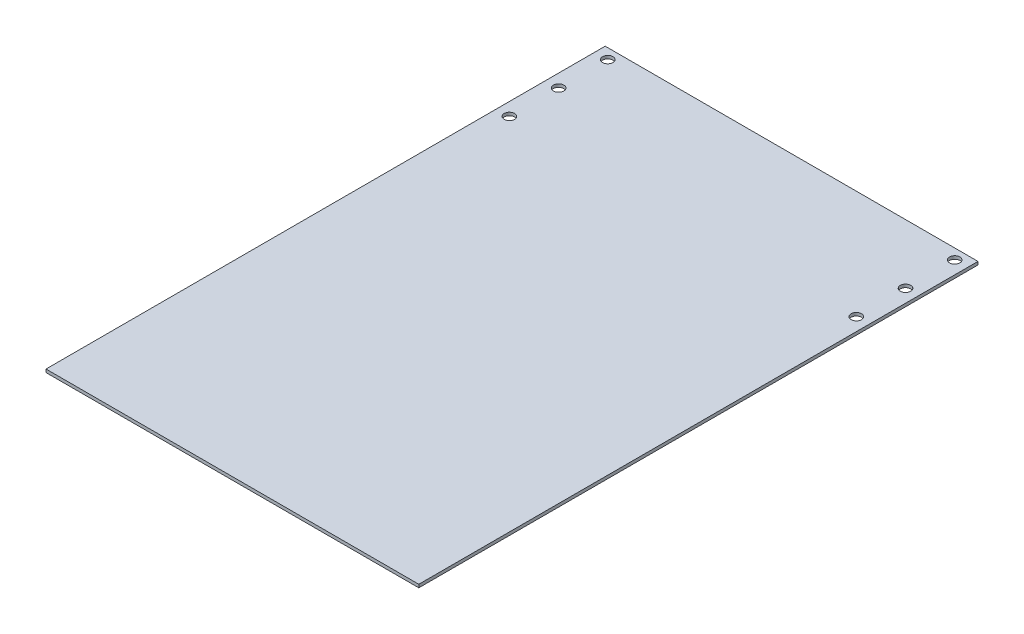
ISO-10303-21;
HEADER;
FILE_DESCRIPTION(('STEP AP214'),'2;1');
FILE_NAME('part.step','',(''),(''),'','','');
FILE_SCHEMA(('AUTOMOTIVE_DESIGN { 1 0 10303 214 1 1 1 1 }'));
ENDSEC;
DATA;
#1=APPLICATION_CONTEXT('core data for automotive mechanical design processes');
#2=APPLICATION_PROTOCOL_DEFINITION('international standard','automotive_design',2000,#1);
#3=PRODUCT_CONTEXT('',#1,'mechanical');
#4=PRODUCT('Part','Part','',(#3));
#5=PRODUCT_RELATED_PRODUCT_CATEGORY('part','',(#4));
#6=PRODUCT_DEFINITION_FORMATION('','',#4);
#7=PRODUCT_DEFINITION_CONTEXT('part definition',#1,'design');
#8=PRODUCT_DEFINITION('design','',#6,#7);
#9=PRODUCT_DEFINITION_SHAPE('','',#8);
#10=(LENGTH_UNIT() NAMED_UNIT(*) SI_UNIT(.MILLI.,.METRE.));
#11=(NAMED_UNIT(*) PLANE_ANGLE_UNIT() SI_UNIT($,.RADIAN.));
#12=(NAMED_UNIT(*) SI_UNIT($,.STERADIAN.) SOLID_ANGLE_UNIT());
#13=UNCERTAINTY_MEASURE_WITH_UNIT(LENGTH_MEASURE(1.E-05),#10,'distance_accuracy_value','');
#14=(GEOMETRIC_REPRESENTATION_CONTEXT(3) GLOBAL_UNCERTAINTY_ASSIGNED_CONTEXT((#13)) GLOBAL_UNIT_ASSIGNED_CONTEXT((#10,
#11,#12)) REPRESENTATION_CONTEXT('',''));
#15=CARTESIAN_POINT('',(0.,0.,0.));
#16=DIRECTION('',(0.,0.,1.));
#17=DIRECTION('',(1.,0.,0.));
#18=AXIS2_PLACEMENT_3D('',#15,#16,#17);
#19=CARTESIAN_POINT('',(180.,3.,270.));
#20=DIRECTION('',(-1.,0.,0.));
#21=DIRECTION('',(0.,0.,1.));
#22=AXIS2_PLACEMENT_3D('',#19,#20,#21);
#23=PLANE('',#22);
#24=DIRECTION('',(0.,0.,-1.));
#25=VECTOR('',#24,1.);
#26=CARTESIAN_POINT('',(180.,0.,270.));
#27=LINE('',#26,#25);
#28=CARTESIAN_POINT('',(180.,0.,270.));
#29=VERTEX_POINT('',#28);
#30=CARTESIAN_POINT('',(180.,0.,-270.));
#31=VERTEX_POINT('',#30);
#32=EDGE_CURVE('E106',#29,#31,#27,.T.);
#33=ORIENTED_EDGE('',*,*,#32,.T.);
#34=DIRECTION('',(0.,-1.,0.));
#35=VECTOR('',#34,1.);
#36=CARTESIAN_POINT('',(180.,3.,-270.));
#37=LINE('',#36,#35);
#38=CARTESIAN_POINT('',(180.,3.,-270.));
#39=VERTEX_POINT('',#38);
#40=EDGE_CURVE('E11',#39,#31,#37,.T.);
#41=ORIENTED_EDGE('',*,*,#40,.F.);
#42=DIRECTION('',(0.,0.,-1.));
#43=VECTOR('',#42,1.);
#44=CARTESIAN_POINT('',(180.,3.,270.));
#45=LINE('',#44,#43);
#46=CARTESIAN_POINT('',(180.,3.,270.));
#47=VERTEX_POINT('',#46);
#48=EDGE_CURVE('E90',#47,#39,#45,.T.);
#49=ORIENTED_EDGE('',*,*,#48,.F.);
#50=DIRECTION('',(0.,-1.,0.));
#51=VECTOR('',#50,1.);
#52=CARTESIAN_POINT('',(180.,3.,270.));
#53=LINE('',#52,#51);
#54=EDGE_CURVE('E102',#47,#29,#53,.T.);
#55=ORIENTED_EDGE('',*,*,#54,.T.);
#56=EDGE_LOOP('',(#33,#41,#49,#55));
#57=FACE_BOUND('',#56,.T.);
#58=ADVANCED_FACE('F38',(#57),#23,.F.);
#59=CARTESIAN_POINT('',(-180.,3.,-270.));
#60=DIRECTION('',(0.,0.,1.));
#61=DIRECTION('',(1.,0.,0.));
#62=AXIS2_PLACEMENT_3D('',#59,#60,#61);
#63=PLANE('',#62);
#64=DIRECTION('',(-1.,0.,0.));
#65=VECTOR('',#64,1.);
#66=CARTESIAN_POINT('',(-180.,0.,-270.));
#67=LINE('',#66,#65);
#68=CARTESIAN_POINT('',(-180.,0.,-270.));
#69=VERTEX_POINT('',#68);
#70=EDGE_CURVE('E95',#31,#69,#67,.T.);
#71=ORIENTED_EDGE('',*,*,#70,.T.);
#72=DIRECTION('',(0.,-1.,0.));
#73=VECTOR('',#72,1.);
#74=CARTESIAN_POINT('',(-180.,3.,-270.));
#75=LINE('',#74,#73);
#76=CARTESIAN_POINT('',(-180.,3.,-270.));
#77=VERTEX_POINT('',#76);
#78=EDGE_CURVE('E47',#77,#69,#75,.T.);
#79=ORIENTED_EDGE('',*,*,#78,.F.);
#80=DIRECTION('',(-1.,0.,0.));
#81=VECTOR('',#80,1.);
#82=CARTESIAN_POINT('',(-180.,3.,-270.));
#83=LINE('',#82,#81);
#84=EDGE_CURVE('E85',#39,#77,#83,.T.);
#85=ORIENTED_EDGE('',*,*,#84,.F.);
#86=ORIENTED_EDGE('',*,*,#40,.T.);
#87=EDGE_LOOP('',(#71,#79,#85,#86));
#88=FACE_BOUND('',#87,.T.);
#89=ADVANCED_FACE('F94',(#88),#63,.F.);
#90=CARTESIAN_POINT('',(-180.,3.,270.));
#91=DIRECTION('',(1.,0.,0.));
#92=DIRECTION('',(0.,0.,-1.));
#93=AXIS2_PLACEMENT_3D('',#90,#91,#92);
#94=PLANE('',#93);
#95=DIRECTION('',(0.,0.,1.));
#96=VECTOR('',#95,1.);
#97=CARTESIAN_POINT('',(-180.,0.,270.));
#98=LINE('',#97,#96);
#99=CARTESIAN_POINT('',(-180.,0.,270.));
#100=VERTEX_POINT('',#99);
#101=EDGE_CURVE('E72',#69,#100,#98,.T.);
#102=ORIENTED_EDGE('',*,*,#101,.T.);
#103=DIRECTION('',(0.,-1.,0.));
#104=VECTOR('',#103,1.);
#105=CARTESIAN_POINT('',(-180.,3.,270.));
#106=LINE('',#105,#104);
#107=CARTESIAN_POINT('',(-180.,3.,270.));
#108=VERTEX_POINT('',#107);
#109=EDGE_CURVE('E97',#108,#100,#106,.T.);
#110=ORIENTED_EDGE('',*,*,#109,.F.);
#111=DIRECTION('',(0.,0.,1.));
#112=VECTOR('',#111,1.);
#113=CARTESIAN_POINT('',(-180.,3.,270.));
#114=LINE('',#113,#112);
#115=EDGE_CURVE('E88',#77,#108,#114,.T.);
#116=ORIENTED_EDGE('',*,*,#115,.F.);
#117=ORIENTED_EDGE('',*,*,#78,.T.);
#118=EDGE_LOOP('',(#102,#110,#116,#117));
#119=FACE_BOUND('',#118,.T.);
#120=ADVANCED_FACE('F98',(#119),#94,.F.);
#121=CARTESIAN_POINT('',(-180.,3.,270.));
#122=DIRECTION('',(0.,0.,-1.));
#123=DIRECTION('',(-1.,0.,0.));
#124=AXIS2_PLACEMENT_3D('',#121,#122,#123);
#125=PLANE('',#124);
#126=DIRECTION('',(1.,0.,0.));
#127=VECTOR('',#126,1.);
#128=CARTESIAN_POINT('',(-180.,0.,270.));
#129=LINE('',#128,#127);
#130=EDGE_CURVE('E78',#100,#29,#129,.T.);
#131=ORIENTED_EDGE('',*,*,#130,.T.);
#132=ORIENTED_EDGE('',*,*,#54,.F.);
#133=DIRECTION('',(1.,0.,0.));
#134=VECTOR('',#133,1.);
#135=CARTESIAN_POINT('',(-180.,3.,270.));
#136=LINE('',#135,#134);
#137=EDGE_CURVE('E55',#108,#47,#136,.T.);
#138=ORIENTED_EDGE('',*,*,#137,.F.);
#139=ORIENTED_EDGE('',*,*,#109,.T.);
#140=EDGE_LOOP('',(#131,#132,#138,#139));
#141=FACE_BOUND('',#140,.T.);
#142=ADVANCED_FACE('F120',(#141),#125,.F.);
#143=CARTESIAN_POINT('',(0.,3.,0.));
#144=DIRECTION('',(0.,-1.,0.));
#145=DIRECTION('',(0.,0.,-1.));
#146=AXIS2_PLACEMENT_3D('',#143,#144,#145);
#147=PLANE('',#146);
#148=CARTESIAN_POINT('',(-167.5,3.,-260.));
#149=DIRECTION('',(0.,-1.,0.));
#150=DIRECTION('',(0.,0.,-1.));
#151=AXIS2_PLACEMENT_3D('',#148,#149,#150);
#152=CIRCLE('',#151,5.00000000000002);
#153=CARTESIAN_POINT('',(-167.5,3.,-265.));
#154=VERTEX_POINT('',#153);
#155=EDGE_CURVE('E110',#154,#154,#152,.T.);
#156=ORIENTED_EDGE('',*,*,#155,.T.);
#157=EDGE_LOOP('',(#156));
#158=FACE_BOUND('',#157,.T.);
#159=CARTESIAN_POINT('',(-167.5,3.,-165.));
#160=DIRECTION('',(0.,-1.,0.));
#161=DIRECTION('',(0.,0.,-1.));
#162=AXIS2_PLACEMENT_3D('',#159,#160,#161);
#163=CIRCLE('',#162,5.00000000000002);
#164=CARTESIAN_POINT('',(-167.5,3.,-170.));
#165=VERTEX_POINT('',#164);
#166=EDGE_CURVE('E130',#165,#165,#163,.T.);
#167=ORIENTED_EDGE('',*,*,#166,.T.);
#168=EDGE_LOOP('',(#167));
#169=FACE_BOUND('',#168,.T.);
#170=CARTESIAN_POINT('',(167.5,3.,-260.));
#171=DIRECTION('',(0.,-1.,0.));
#172=DIRECTION('',(0.,0.,-1.));
#173=AXIS2_PLACEMENT_3D('',#170,#171,#172);
#174=CIRCLE('',#173,5.00000000000002);
#175=CARTESIAN_POINT('',(167.5,3.,-265.));
#176=VERTEX_POINT('',#175);
#177=EDGE_CURVE('E134',#176,#176,#174,.T.);
#178=ORIENTED_EDGE('',*,*,#177,.T.);
#179=EDGE_LOOP('',(#178));
#180=FACE_BOUND('',#179,.T.);
#181=CARTESIAN_POINT('',(167.5,3.,-165.));
#182=DIRECTION('',(0.,-1.,0.));
#183=DIRECTION('',(0.,0.,-1.));
#184=AXIS2_PLACEMENT_3D('',#181,#182,#183);
#185=CIRCLE('',#184,5.00000000000002);
#186=CARTESIAN_POINT('',(167.5,3.,-170.));
#187=VERTEX_POINT('',#186);
#188=EDGE_CURVE('E138',#187,#187,#185,.T.);
#189=ORIENTED_EDGE('',*,*,#188,.T.);
#190=EDGE_LOOP('',(#189));
#191=FACE_BOUND('',#190,.T.);
#192=CARTESIAN_POINT('',(167.5,3.,-212.5));
#193=DIRECTION('',(0.,-1.,0.));
#194=DIRECTION('',(0.,0.,-1.));
#195=AXIS2_PLACEMENT_3D('',#192,#193,#194);
#196=CIRCLE('',#195,4.99999999999999);
#197=CARTESIAN_POINT('',(167.5,3.,-217.5));
#198=VERTEX_POINT('',#197);
#199=EDGE_CURVE('E142',#198,#198,#196,.T.);
#200=ORIENTED_EDGE('',*,*,#199,.T.);
#201=EDGE_LOOP('',(#200));
#202=FACE_BOUND('',#201,.T.);
#203=CARTESIAN_POINT('',(-167.5,3.,-212.5));
#204=DIRECTION('',(0.,-1.,0.));
#205=DIRECTION('',(0.,0.,-1.));
#206=AXIS2_PLACEMENT_3D('',#203,#204,#205);
#207=CIRCLE('',#206,4.99999999999999);
#208=CARTESIAN_POINT('',(-167.5,3.,-217.5));
#209=VERTEX_POINT('',#208);
#210=EDGE_CURVE('E146',#209,#209,#207,.T.);
#211=ORIENTED_EDGE('',*,*,#210,.T.);
#212=EDGE_LOOP('',(#211));
#213=FACE_BOUND('',#212,.T.);
#214=ORIENTED_EDGE('',*,*,#48,.T.);
#215=ORIENTED_EDGE('',*,*,#84,.T.);
#216=ORIENTED_EDGE('',*,*,#115,.T.);
#217=ORIENTED_EDGE('',*,*,#137,.T.);
#218=EDGE_LOOP('',(#214,#215,#216,#217));
#219=FACE_BOUND('',#218,.T.);
#220=ADVANCED_FACE('F86',(#158,#169,#180,#191,#202,#213,#219),#147,.F.);
#221=CARTESIAN_POINT('',(0.,0.,0.));
#222=DIRECTION('',(0.,-1.,0.));
#223=DIRECTION('',(0.,0.,-1.));
#224=AXIS2_PLACEMENT_3D('',#221,#222,#223);
#225=PLANE('',#224);
#226=CARTESIAN_POINT('',(-167.5,0.,-260.));
#227=DIRECTION('',(0.,1.,0.));
#228=DIRECTION('',(0.,0.,-1.));
#229=AXIS2_PLACEMENT_3D('',#226,#227,#228);
#230=CIRCLE('',#229,5.00000000000002);
#231=CARTESIAN_POINT('',(-167.5,0.,-265.));
#232=VERTEX_POINT('',#231);
#233=EDGE_CURVE('E154',#232,#232,#230,.T.);
#234=ORIENTED_EDGE('',*,*,#233,.T.);
#235=EDGE_LOOP('',(#234));
#236=FACE_BOUND('',#235,.T.);
#237=CARTESIAN_POINT('',(-167.5,0.,-165.));
#238=DIRECTION('',(0.,1.,0.));
#239=DIRECTION('',(0.,0.,1.));
#240=AXIS2_PLACEMENT_3D('',#237,#238,#239);
#241=CIRCLE('',#240,5.00000000000002);
#242=CARTESIAN_POINT('',(-167.5,0.,-160.));
#243=VERTEX_POINT('',#242);
#244=EDGE_CURVE('E164',#243,#243,#241,.T.);
#245=ORIENTED_EDGE('',*,*,#244,.T.);
#246=EDGE_LOOP('',(#245));
#247=FACE_BOUND('',#246,.T.);
#248=CARTESIAN_POINT('',(167.5,0.,-260.));
#249=DIRECTION('',(0.,1.,0.));
#250=DIRECTION('',(0.,0.,1.));
#251=AXIS2_PLACEMENT_3D('',#248,#249,#250);
#252=CIRCLE('',#251,5.00000000000002);
#253=CARTESIAN_POINT('',(167.5,0.,-255.));
#254=VERTEX_POINT('',#253);
#255=EDGE_CURVE('E159',#254,#254,#252,.T.);
#256=ORIENTED_EDGE('',*,*,#255,.T.);
#257=EDGE_LOOP('',(#256));
#258=FACE_BOUND('',#257,.T.);
#259=CARTESIAN_POINT('',(167.5,0.,-165.));
#260=DIRECTION('',(0.,1.,0.));
#261=DIRECTION('',(0.,0.,-1.));
#262=AXIS2_PLACEMENT_3D('',#259,#260,#261);
#263=CIRCLE('',#262,5.00000000000002);
#264=CARTESIAN_POINT('',(167.5,0.,-170.));
#265=VERTEX_POINT('',#264);
#266=EDGE_CURVE('E155',#265,#265,#263,.T.);
#267=ORIENTED_EDGE('',*,*,#266,.T.);
#268=EDGE_LOOP('',(#267));
#269=FACE_BOUND('',#268,.T.);
#270=CARTESIAN_POINT('',(167.5,0.,-212.5));
#271=DIRECTION('',(0.,1.,0.));
#272=DIRECTION('',(0.,0.,-1.));
#273=AXIS2_PLACEMENT_3D('',#270,#271,#272);
#274=CIRCLE('',#273,4.99999999999999);
#275=CARTESIAN_POINT('',(167.5,0.,-217.5));
#276=VERTEX_POINT('',#275);
#277=EDGE_CURVE('E160',#276,#276,#274,.T.);
#278=ORIENTED_EDGE('',*,*,#277,.T.);
#279=EDGE_LOOP('',(#278));
#280=FACE_BOUND('',#279,.T.);
#281=CARTESIAN_POINT('',(-167.5,0.,-212.5));
#282=DIRECTION('',(0.,1.,0.));
#283=DIRECTION('',(0.,0.,1.));
#284=AXIS2_PLACEMENT_3D('',#281,#282,#283);
#285=CIRCLE('',#284,4.99999999999999);
#286=CARTESIAN_POINT('',(-167.5,0.,-207.5));
#287=VERTEX_POINT('',#286);
#288=EDGE_CURVE('E150',#287,#287,#285,.T.);
#289=ORIENTED_EDGE('',*,*,#288,.T.);
#290=EDGE_LOOP('',(#289));
#291=FACE_BOUND('',#290,.T.);
#292=ORIENTED_EDGE('',*,*,#32,.F.);
#293=ORIENTED_EDGE('',*,*,#130,.F.);
#294=ORIENTED_EDGE('',*,*,#101,.F.);
#295=ORIENTED_EDGE('',*,*,#70,.F.);
#296=EDGE_LOOP('',(#292,#293,#294,#295));
#297=FACE_BOUND('',#296,.T.);
#298=ADVANCED_FACE('F123',(#236,#247,#258,#269,#280,#291,#297),#225,.T.);
#299=CARTESIAN_POINT('',(-167.5,0.,-212.5));
#300=DIRECTION('',(0.,1.,0.));
#301=DIRECTION('',(0.,0.,1.));
#302=AXIS2_PLACEMENT_3D('',#299,#300,#301);
#303=CYLINDRICAL_SURFACE('',#302,4.99999999999999);
#304=ORIENTED_EDGE('',*,*,#288,.F.);
#305=EDGE_LOOP('',(#304));
#306=FACE_BOUND('',#305,.T.);
#307=ORIENTED_EDGE('',*,*,#210,.F.);
#308=EDGE_LOOP('',(#307));
#309=FACE_BOUND('',#308,.T.);
#310=ADVANCED_FACE('F181',(#306,#309),#303,.F.);
#311=CARTESIAN_POINT('',(167.5,0.,-212.5));
#312=DIRECTION('',(0.,1.,0.));
#313=DIRECTION('',(0.,0.,1.));
#314=AXIS2_PLACEMENT_3D('',#311,#312,#313);
#315=CYLINDRICAL_SURFACE('',#314,4.99999999999999);
#316=ORIENTED_EDGE('',*,*,#277,.F.);
#317=EDGE_LOOP('',(#316));
#318=FACE_BOUND('',#317,.T.);
#319=ORIENTED_EDGE('',*,*,#199,.F.);
#320=EDGE_LOOP('',(#319));
#321=FACE_BOUND('',#320,.T.);
#322=ADVANCED_FACE('F177',(#318,#321),#315,.F.);
#323=CARTESIAN_POINT('',(167.5,0.,-165.));
#324=DIRECTION('',(0.,1.,0.));
#325=DIRECTION('',(0.,0.,1.));
#326=AXIS2_PLACEMENT_3D('',#323,#324,#325);
#327=CYLINDRICAL_SURFACE('',#326,5.00000000000002);
#328=ORIENTED_EDGE('',*,*,#266,.F.);
#329=EDGE_LOOP('',(#328));
#330=FACE_BOUND('',#329,.T.);
#331=ORIENTED_EDGE('',*,*,#188,.F.);
#332=EDGE_LOOP('',(#331));
#333=FACE_BOUND('',#332,.T.);
#334=ADVANCED_FACE('F180',(#330,#333),#327,.F.);
#335=CARTESIAN_POINT('',(167.5,0.,-260.));
#336=DIRECTION('',(0.,1.,0.));
#337=DIRECTION('',(0.,0.,1.));
#338=AXIS2_PLACEMENT_3D('',#335,#336,#337);
#339=CYLINDRICAL_SURFACE('',#338,5.00000000000002);
#340=ORIENTED_EDGE('',*,*,#255,.F.);
#341=EDGE_LOOP('',(#340));
#342=FACE_BOUND('',#341,.T.);
#343=ORIENTED_EDGE('',*,*,#177,.F.);
#344=EDGE_LOOP('',(#343));
#345=FACE_BOUND('',#344,.T.);
#346=ADVANCED_FACE('F244',(#342,#345),#339,.F.);
#347=CARTESIAN_POINT('',(-167.5,0.,-165.));
#348=DIRECTION('',(0.,1.,0.));
#349=DIRECTION('',(0.,0.,1.));
#350=AXIS2_PLACEMENT_3D('',#347,#348,#349);
#351=CYLINDRICAL_SURFACE('',#350,5.00000000000002);
#352=ORIENTED_EDGE('',*,*,#244,.F.);
#353=EDGE_LOOP('',(#352));
#354=FACE_BOUND('',#353,.T.);
#355=ORIENTED_EDGE('',*,*,#166,.F.);
#356=EDGE_LOOP('',(#355));
#357=FACE_BOUND('',#356,.T.);
#358=ADVANCED_FACE('F253',(#354,#357),#351,.F.);
#359=CARTESIAN_POINT('',(-167.5,0.,-260.));
#360=DIRECTION('',(0.,1.,0.));
#361=DIRECTION('',(0.,0.,1.));
#362=AXIS2_PLACEMENT_3D('',#359,#360,#361);
#363=CYLINDRICAL_SURFACE('',#362,5.00000000000002);
#364=ORIENTED_EDGE('',*,*,#233,.F.);
#365=EDGE_LOOP('',(#364));
#366=FACE_BOUND('',#365,.T.);
#367=ORIENTED_EDGE('',*,*,#155,.F.);
#368=EDGE_LOOP('',(#367));
#369=FACE_BOUND('',#368,.T.);
#370=ADVANCED_FACE('F263',(#366,#369),#363,.F.);
#371=CLOSED_SHELL('',(#58,#89,#120,#142,#220,#298,#310,#322,#334,#346,#358,#370));
#372=MANIFOLD_SOLID_BREP('B2',#371);
#373=ADVANCED_BREP_SHAPE_REPRESENTATION('',(#18,#372),#14);
#374=SHAPE_DEFINITION_REPRESENTATION(#9,#373);
ENDSEC;
END-ISO-10303-21;
